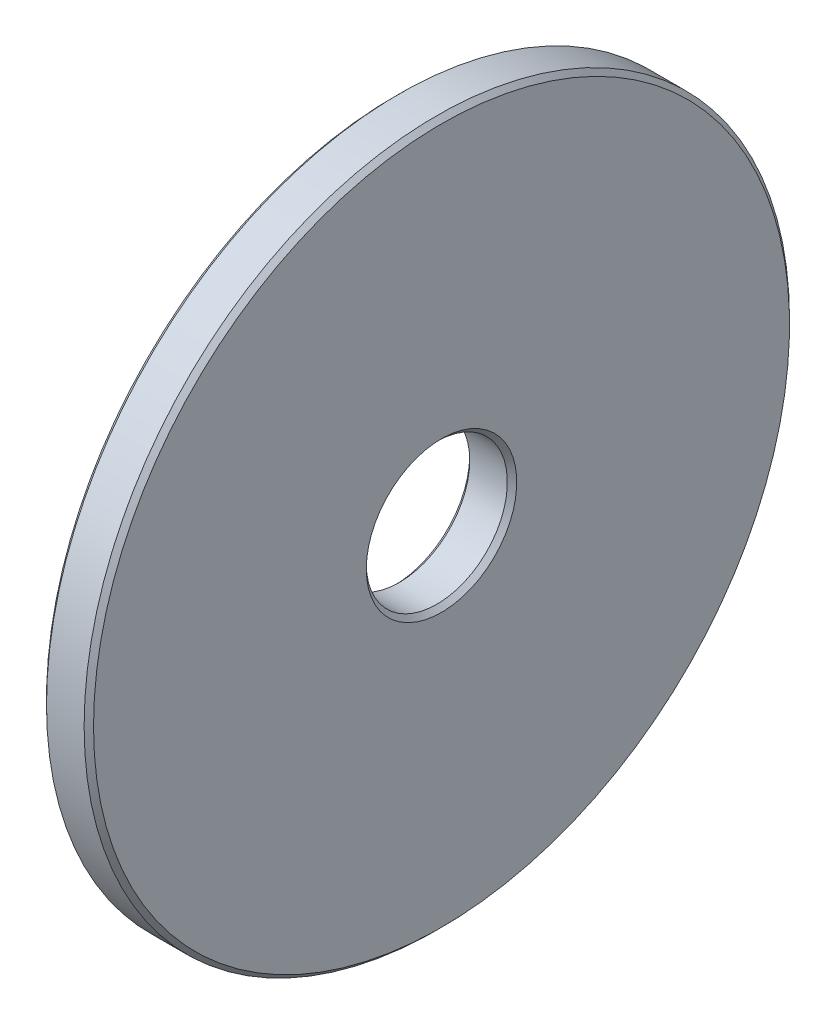
ISO-10303-21;
HEADER;
FILE_DESCRIPTION(('STEP AP214'),'2;1');
FILE_NAME('part.step','',(''),(''),'','','');
FILE_SCHEMA(('AUTOMOTIVE_DESIGN { 1 0 10303 214 1 1 1 1 }'));
ENDSEC;
DATA;
#1=APPLICATION_CONTEXT('core data for automotive mechanical design processes');
#2=APPLICATION_PROTOCOL_DEFINITION('international standard','automotive_design',2000,#1);
#3=PRODUCT_CONTEXT('',#1,'mechanical');
#4=PRODUCT('Part','Part','',(#3));
#5=PRODUCT_RELATED_PRODUCT_CATEGORY('part','',(#4));
#6=PRODUCT_DEFINITION_FORMATION('','',#4);
#7=PRODUCT_DEFINITION_CONTEXT('part definition',#1,'design');
#8=PRODUCT_DEFINITION('design','',#6,#7);
#9=PRODUCT_DEFINITION_SHAPE('','',#8);
#10=(LENGTH_UNIT() NAMED_UNIT(*) SI_UNIT(.MILLI.,.METRE.));
#11=(NAMED_UNIT(*) PLANE_ANGLE_UNIT() SI_UNIT($,.RADIAN.));
#12=(NAMED_UNIT(*) SI_UNIT($,.STERADIAN.) SOLID_ANGLE_UNIT());
#13=UNCERTAINTY_MEASURE_WITH_UNIT(LENGTH_MEASURE(1.E-05),#10,'distance_accuracy_value','');
#14=(GEOMETRIC_REPRESENTATION_CONTEXT(3) GLOBAL_UNCERTAINTY_ASSIGNED_CONTEXT((#13)) GLOBAL_UNIT_ASSIGNED_CONTEXT((#10,
#11,#12)) REPRESENTATION_CONTEXT('',''));
#15=CARTESIAN_POINT('',(0.,0.,0.));
#16=DIRECTION('',(0.,0.,1.));
#17=DIRECTION('',(1.,0.,0.));
#18=AXIS2_PLACEMENT_3D('',#15,#16,#17);
#19=CARTESIAN_POINT('',(-11.6246988911114,0.,0.));
#20=DIRECTION('',(-1.,0.,0.));
#21=DIRECTION('',(0.,0.,1.));
#22=AXIS2_PLACEMENT_3D('',#19,#20,#21);
#23=CYLINDRICAL_SURFACE('',#22,1.5);
#24=CARTESIAN_POINT('',(-0.900000000000003,0.,0.));
#25=DIRECTION('',(1.,0.,0.));
#26=DIRECTION('',(0.,0.,-1.));
#27=AXIS2_PLACEMENT_3D('',#24,#25,#26);
#28=CIRCLE('',#27,1.5);
#29=CARTESIAN_POINT('',(-0.900000000000003,0.,-1.5));
#30=VERTEX_POINT('',#29);
#31=EDGE_CURVE('E61',#30,#30,#28,.F.);
#32=ORIENTED_EDGE('',*,*,#31,.T.);
#33=EDGE_LOOP('',(#32));
#34=FACE_BOUND('',#33,.T.);
#35=CARTESIAN_POINT('',(-0.0999999999999977,0.,0.));
#36=DIRECTION('',(-1.,0.,0.));
#37=DIRECTION('',(0.,0.,1.));
#38=AXIS2_PLACEMENT_3D('',#35,#36,#37);
#39=CIRCLE('',#38,1.5);
#40=CARTESIAN_POINT('',(-0.0999999999999977,0.,1.5));
#41=VERTEX_POINT('',#40);
#42=EDGE_CURVE('E64',#41,#41,#39,.F.);
#43=ORIENTED_EDGE('',*,*,#42,.T.);
#44=EDGE_LOOP('',(#43));
#45=FACE_BOUND('',#44,.T.);
#46=ADVANCED_FACE('F35',(#34,#45),#23,.F.);
#47=CARTESIAN_POINT('',(0.,1.5,0.));
#48=DIRECTION('',(-1.,0.,0.));
#49=DIRECTION('',(0.,0.,1.));
#50=AXIS2_PLACEMENT_3D('',#47,#48,#49);
#51=PLANE('',#50);
#52=CARTESIAN_POINT('',(0.,0.,0.));
#53=DIRECTION('',(-1.,0.,0.));
#54=DIRECTION('',(0.,0.,1.));
#55=AXIS2_PLACEMENT_3D('',#52,#53,#54);
#56=CIRCLE('',#55,1.6);
#57=CARTESIAN_POINT('',(0.,0.,1.6));
#58=VERTEX_POINT('',#57);
#59=EDGE_CURVE('E46',#58,#58,#56,.T.);
#60=ORIENTED_EDGE('',*,*,#59,.T.);
#61=EDGE_LOOP('',(#60));
#62=FACE_BOUND('',#61,.T.);
#63=CARTESIAN_POINT('',(0.,0.,0.));
#64=DIRECTION('',(-1.,0.,0.));
#65=DIRECTION('',(0.,0.,1.));
#66=AXIS2_PLACEMENT_3D('',#63,#64,#65);
#67=CIRCLE('',#66,7.4);
#68=CARTESIAN_POINT('',(0.,0.,7.4));
#69=VERTEX_POINT('',#68);
#70=EDGE_CURVE('E50',#69,#69,#67,.F.);
#71=ORIENTED_EDGE('',*,*,#70,.T.);
#72=EDGE_LOOP('',(#71));
#73=FACE_BOUND('',#72,.T.);
#74=ADVANCED_FACE('F77',(#62,#73),#51,.F.);
#75=CARTESIAN_POINT('',(-11.6246988911114,0.,0.));
#76=DIRECTION('',(-1.,0.,0.));
#77=DIRECTION('',(0.,0.,1.));
#78=AXIS2_PLACEMENT_3D('',#75,#76,#77);
#79=CYLINDRICAL_SURFACE('',#78,7.5);
#80=CARTESIAN_POINT('',(-0.100000000000001,0.,0.));
#81=DIRECTION('',(-1.,0.,0.));
#82=DIRECTION('',(0.,0.,1.));
#83=AXIS2_PLACEMENT_3D('',#80,#81,#82);
#84=CIRCLE('',#83,7.5);
#85=CARTESIAN_POINT('',(-0.100000000000001,0.,7.5));
#86=VERTEX_POINT('',#85);
#87=EDGE_CURVE('E10',#86,#86,#84,.T.);
#88=ORIENTED_EDGE('',*,*,#87,.T.);
#89=EDGE_LOOP('',(#88));
#90=FACE_BOUND('',#89,.T.);
#91=CARTESIAN_POINT('',(-0.900000000000001,0.,0.));
#92=DIRECTION('',(1.,0.,0.));
#93=DIRECTION('',(0.,0.,-1.));
#94=AXIS2_PLACEMENT_3D('',#91,#92,#93);
#95=CIRCLE('',#94,7.5);
#96=CARTESIAN_POINT('',(-0.900000000000001,0.,-7.5));
#97=VERTEX_POINT('',#96);
#98=EDGE_CURVE('E42',#97,#97,#95,.T.);
#99=ORIENTED_EDGE('',*,*,#98,.T.);
#100=EDGE_LOOP('',(#99));
#101=FACE_BOUND('',#100,.T.);
#102=ADVANCED_FACE('F80',(#90,#101),#79,.T.);
#103=CARTESIAN_POINT('',(-1.,7.5,0.));
#104=DIRECTION('',(1.,0.,0.));
#105=DIRECTION('',(0.,0.,-1.));
#106=AXIS2_PLACEMENT_3D('',#103,#104,#105);
#107=PLANE('',#106);
#108=CARTESIAN_POINT('',(-1.,0.,0.));
#109=DIRECTION('',(1.,0.,0.));
#110=DIRECTION('',(0.,0.,-1.));
#111=AXIS2_PLACEMENT_3D('',#108,#109,#110);
#112=CIRCLE('',#111,1.6);
#113=CARTESIAN_POINT('',(-1.,0.,-1.6));
#114=VERTEX_POINT('',#113);
#115=EDGE_CURVE('E55',#114,#114,#112,.T.);
#116=ORIENTED_EDGE('',*,*,#115,.T.);
#117=EDGE_LOOP('',(#116));
#118=FACE_BOUND('',#117,.T.);
#119=CARTESIAN_POINT('',(-1.,0.,0.));
#120=DIRECTION('',(1.,0.,0.));
#121=DIRECTION('',(0.,0.,-1.));
#122=AXIS2_PLACEMENT_3D('',#119,#120,#121);
#123=CIRCLE('',#122,7.4);
#124=CARTESIAN_POINT('',(-1.,0.,-7.4));
#125=VERTEX_POINT('',#124);
#126=EDGE_CURVE('E58',#125,#125,#123,.F.);
#127=ORIENTED_EDGE('',*,*,#126,.T.);
#128=EDGE_LOOP('',(#127));
#129=FACE_BOUND('',#128,.T.);
#130=ADVANCED_FACE('F98',(#118,#129),#107,.F.);
#131=CARTESIAN_POINT('',(-0.900000000000003,0.,0.));
#132=DIRECTION('',(-1.,0.,0.));
#133=DIRECTION('',(0.,0.,1.));
#134=AXIS2_PLACEMENT_3D('',#131,#132,#133);
#135=CONICAL_SURFACE('',#134,1.5,0.785398163397463);
#136=ORIENTED_EDGE('',*,*,#115,.F.);
#137=EDGE_LOOP('',(#136));
#138=FACE_BOUND('',#137,.T.);
#139=ORIENTED_EDGE('',*,*,#31,.F.);
#140=EDGE_LOOP('',(#139));
#141=FACE_BOUND('',#140,.T.);
#142=ADVANCED_FACE('F73',(#138,#141),#135,.F.);
#143=CARTESIAN_POINT('',(0.,0.,0.));
#144=DIRECTION('',(1.,0.,0.));
#145=DIRECTION('',(0.,0.,-1.));
#146=AXIS2_PLACEMENT_3D('',#143,#144,#145);
#147=CONICAL_SURFACE('',#146,1.6,0.785398163397455);
#148=ORIENTED_EDGE('',*,*,#42,.F.);
#149=EDGE_LOOP('',(#148));
#150=FACE_BOUND('',#149,.T.);
#151=ORIENTED_EDGE('',*,*,#59,.F.);
#152=EDGE_LOOP('',(#151));
#153=FACE_BOUND('',#152,.T.);
#154=ADVANCED_FACE('F69',(#150,#153),#147,.F.);
#155=CARTESIAN_POINT('',(-0.100000000000001,0.,0.));
#156=DIRECTION('',(-1.,0.,0.));
#157=DIRECTION('',(0.,0.,1.));
#158=AXIS2_PLACEMENT_3D('',#155,#156,#157);
#159=CONICAL_SURFACE('',#158,7.5,0.785398163397453);
#160=ORIENTED_EDGE('',*,*,#70,.F.);
#161=EDGE_LOOP('',(#160));
#162=FACE_BOUND('',#161,.T.);
#163=ORIENTED_EDGE('',*,*,#87,.F.);
#164=EDGE_LOOP('',(#163));
#165=FACE_BOUND('',#164,.T.);
#166=ADVANCED_FACE('F72',(#162,#165),#159,.T.);
#167=CARTESIAN_POINT('',(-0.999999999999999,0.,0.));
#168=DIRECTION('',(1.,0.,0.));
#169=DIRECTION('',(0.,0.,-1.));
#170=AXIS2_PLACEMENT_3D('',#167,#168,#169);
#171=CONICAL_SURFACE('',#170,7.4,0.785398163397461);
#172=ORIENTED_EDGE('',*,*,#98,.F.);
#173=EDGE_LOOP('',(#172));
#174=FACE_BOUND('',#173,.T.);
#175=ORIENTED_EDGE('',*,*,#126,.F.);
#176=EDGE_LOOP('',(#175));
#177=FACE_BOUND('',#176,.T.);
#178=ADVANCED_FACE('F37',(#174,#177),#171,.T.);
#179=CLOSED_SHELL('',(#46,#74,#102,#130,#142,#154,#166,#178));
#180=MANIFOLD_SOLID_BREP('B2',#179);
#181=ADVANCED_BREP_SHAPE_REPRESENTATION('',(#18,#180),#14);
#182=SHAPE_DEFINITION_REPRESENTATION(#9,#181);
ENDSEC;
END-ISO-10303-21;
